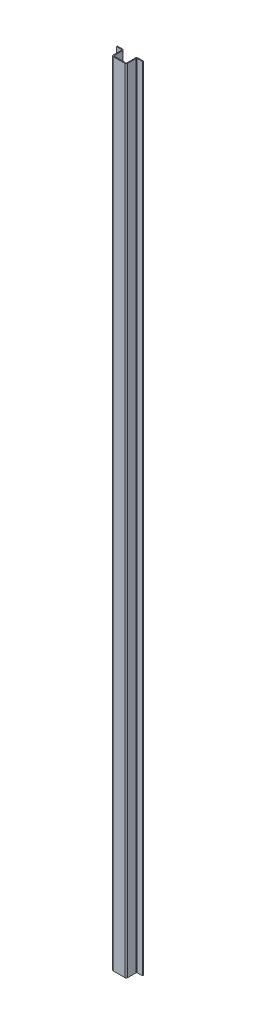
ISO-10303-21;
HEADER;
FILE_DESCRIPTION(('STEP AP214'),'2;1');
FILE_NAME('part.step','',(''),(''),'','','');
FILE_SCHEMA(('AUTOMOTIVE_DESIGN { 1 0 10303 214 1 1 1 1 }'));
ENDSEC;
DATA;
#1=APPLICATION_CONTEXT('core data for automotive mechanical design processes');
#2=APPLICATION_PROTOCOL_DEFINITION('international standard','automotive_design',2000,#1);
#3=PRODUCT_CONTEXT('',#1,'mechanical');
#4=PRODUCT('Part','Part','',(#3));
#5=PRODUCT_RELATED_PRODUCT_CATEGORY('part','',(#4));
#6=PRODUCT_DEFINITION_FORMATION('','',#4);
#7=PRODUCT_DEFINITION_CONTEXT('part definition',#1,'design');
#8=PRODUCT_DEFINITION('design','',#6,#7);
#9=PRODUCT_DEFINITION_SHAPE('','',#8);
#10=(LENGTH_UNIT() NAMED_UNIT(*) SI_UNIT(.MILLI.,.METRE.));
#11=(NAMED_UNIT(*) PLANE_ANGLE_UNIT() SI_UNIT($,.RADIAN.));
#12=(NAMED_UNIT(*) SI_UNIT($,.STERADIAN.) SOLID_ANGLE_UNIT());
#13=UNCERTAINTY_MEASURE_WITH_UNIT(LENGTH_MEASURE(1.E-05),#10,'distance_accuracy_value','');
#14=(GEOMETRIC_REPRESENTATION_CONTEXT(3) GLOBAL_UNCERTAINTY_ASSIGNED_CONTEXT((#13)) GLOBAL_UNIT_ASSIGNED_CONTEXT((#10,
#11,#12)) REPRESENTATION_CONTEXT('',''));
#15=CARTESIAN_POINT('',(0.,0.,0.));
#16=DIRECTION('',(0.,0.,1.));
#17=DIRECTION('',(1.,0.,0.));
#18=AXIS2_PLACEMENT_3D('',#15,#16,#17);
#19=CARTESIAN_POINT('',(-172.,-687.500000000001,2753.05890845996));
#20=DIRECTION('',(1.,0.,0.));
#21=DIRECTION('',(0.,0.,-1.));
#22=AXIS2_PLACEMENT_3D('',#19,#20,#21);
#23=PLANE('',#22);
#24=DIRECTION('',(0.,1.,0.));
#25=VECTOR('',#24,1.);
#26=CARTESIAN_POINT('',(-172.,-687.500000000001,1.5));
#27=LINE('',#26,#25);
#28=CARTESIAN_POINT('',(-172.,687.499999999999,1.5));
#29=VERTEX_POINT('',#28);
#30=CARTESIAN_POINT('',(-172.,-687.500000000001,1.5));
#31=VERTEX_POINT('',#30);
#32=EDGE_CURVE('E278',#29,#31,#27,.F.);
#33=ORIENTED_EDGE('',*,*,#32,.F.);
#34=DIRECTION('',(0.,0.,-1.));
#35=VECTOR('',#34,1.);
#36=CARTESIAN_POINT('',(-172.,687.499999999999,2753.05890845996));
#37=LINE('',#36,#35);
#38=CARTESIAN_POINT('',(-172.,687.499999999999,2.99999999999989));
#39=VERTEX_POINT('',#38);
#40=EDGE_CURVE('E273',#39,#29,#37,.T.);
#41=ORIENTED_EDGE('',*,*,#40,.F.);
#42=DIRECTION('',(0.,1.,0.));
#43=VECTOR('',#42,1.);
#44=CARTESIAN_POINT('',(-172.,-687.500000000001,3.));
#45=LINE('',#44,#43);
#46=CARTESIAN_POINT('',(-172.,-687.500000000001,2.99999999999989));
#47=VERTEX_POINT('',#46);
#48=EDGE_CURVE('E75',#39,#47,#45,.F.);
#49=ORIENTED_EDGE('',*,*,#48,.T.);
#50=DIRECTION('',(0.,0.,-1.));
#51=VECTOR('',#50,1.);
#52=CARTESIAN_POINT('',(-172.,-687.500000000001,2753.05890845996));
#53=LINE('',#52,#51);
#54=EDGE_CURVE('E286',#47,#31,#53,.T.);
#55=ORIENTED_EDGE('',*,*,#54,.T.);
#56=EDGE_LOOP('',(#33,#41,#49,#55));
#57=FACE_BOUND('',#56,.T.);
#58=ADVANCED_FACE('F36',(#57),#23,.T.);
#59=CARTESIAN_POINT('',(-183.5,-687.500000000001,2753.05890845996));
#60=DIRECTION('',(0.,1.,0.));
#61=DIRECTION('',(0.,0.,1.));
#62=AXIS2_PLACEMENT_3D('',#59,#60,#61);
#63=PLANE('',#62);
#64=DIRECTION('',(0.,0.,-1.));
#65=VECTOR('',#64,1.);
#66=CARTESIAN_POINT('',(-181.,-687.500000000001,2753.05890845996));
#67=LINE('',#66,#65);
#68=CARTESIAN_POINT('',(-181.,-687.500000000001,2.99999999999994));
#69=VERTEX_POINT('',#68);
#70=CARTESIAN_POINT('',(-181.,-687.500000000001,1.49999999999994));
#71=VERTEX_POINT('',#70);
#72=EDGE_CURVE('E283',#69,#71,#67,.T.);
#73=ORIENTED_EDGE('',*,*,#72,.T.);
#74=DIRECTION('',(1.,0.,0.));
#75=VECTOR('',#74,1.);
#76=CARTESIAN_POINT('',(-183.5,-687.500000000001,1.5));
#77=LINE('',#76,#75);
#78=EDGE_CURVE('E275',#31,#71,#77,.F.);
#79=ORIENTED_EDGE('',*,*,#78,.F.);
#80=ORIENTED_EDGE('',*,*,#54,.F.);
#81=DIRECTION('',(1.,0.,0.));
#82=VECTOR('',#81,1.);
#83=CARTESIAN_POINT('',(-183.5,-687.500000000001,3.));
#84=LINE('',#83,#82);
#85=EDGE_CURVE('E46',#69,#47,#84,.T.);
#86=ORIENTED_EDGE('',*,*,#85,.F.);
#87=EDGE_LOOP('',(#73,#79,#80,#86));
#88=FACE_BOUND('',#87,.T.);
#89=ADVANCED_FACE('F298',(#88),#63,.F.);
#90=CARTESIAN_POINT('',(-172.,-687.500000000001,1.5));
#91=DIRECTION('',(0.,0.,1.));
#92=DIRECTION('',(-1.,0.,0.));
#93=AXIS2_PLACEMENT_3D('',#90,#91,#92);
#94=PLANE('',#93);
#95=DIRECTION('',(0.,1.,0.));
#96=VECTOR('',#95,1.);
#97=CARTESIAN_POINT('',(-181.,-687.500000000001,1.5));
#98=LINE('',#97,#96);
#99=CARTESIAN_POINT('',(-181.,687.499999999999,1.5));
#100=VERTEX_POINT('',#99);
#101=EDGE_CURVE('E281',#71,#100,#98,.T.);
#102=ORIENTED_EDGE('',*,*,#101,.T.);
#103=DIRECTION('',(1.,0.,0.));
#104=VECTOR('',#103,1.);
#105=CARTESIAN_POINT('',(-205.5,687.499999999999,1.5));
#106=LINE('',#105,#104);
#107=EDGE_CURVE('E68',#100,#29,#106,.T.);
#108=ORIENTED_EDGE('',*,*,#107,.T.);
#109=ORIENTED_EDGE('',*,*,#32,.T.);
#110=ORIENTED_EDGE('',*,*,#78,.T.);
#111=EDGE_LOOP('',(#102,#108,#109,#110));
#112=FACE_BOUND('',#111,.T.);
#113=ADVANCED_FACE('F300',(#112),#94,.F.);
#114=CARTESIAN_POINT('',(-205.5,687.499999999999,2753.05890845996));
#115=DIRECTION('',(0.,-1.,0.));
#116=DIRECTION('',(0.,0.,-1.));
#117=AXIS2_PLACEMENT_3D('',#114,#115,#116);
#118=PLANE('',#117);
#119=ORIENTED_EDGE('',*,*,#40,.T.);
#120=ORIENTED_EDGE('',*,*,#107,.F.);
#121=DIRECTION('',(0.,0.,-1.));
#122=VECTOR('',#121,1.);
#123=CARTESIAN_POINT('',(-181.,687.499999999999,2753.05890845996));
#124=LINE('',#123,#122);
#125=CARTESIAN_POINT('',(-181.,687.499999999999,2.99999999999994));
#126=VERTEX_POINT('',#125);
#127=EDGE_CURVE('E220',#126,#100,#124,.T.);
#128=ORIENTED_EDGE('',*,*,#127,.F.);
#129=DIRECTION('',(1.,0.,0.));
#130=VECTOR('',#129,1.);
#131=CARTESIAN_POINT('',(-205.5,687.499999999999,3.));
#132=LINE('',#131,#130);
#133=EDGE_CURVE('E11',#39,#126,#132,.F.);
#134=ORIENTED_EDGE('',*,*,#133,.F.);
#135=EDGE_LOOP('',(#119,#120,#128,#134));
#136=FACE_BOUND('',#135,.T.);
#137=ADVANCED_FACE('F296',(#136),#118,.F.);
#138=CARTESIAN_POINT('',(-172.,-687.500000000001,3.));
#139=DIRECTION('',(0.,0.,1.));
#140=DIRECTION('',(-1.,0.,0.));
#141=AXIS2_PLACEMENT_3D('',#138,#139,#140);
#142=PLANE('',#141);
#143=DIRECTION('',(0.,1.,0.));
#144=VECTOR('',#143,1.);
#145=CARTESIAN_POINT('',(-181.,-687.500000000001,3.));
#146=LINE('',#145,#144);
#147=EDGE_CURVE('E40',#69,#126,#146,.T.);
#148=ORIENTED_EDGE('',*,*,#147,.F.);
#149=ORIENTED_EDGE('',*,*,#85,.T.);
#150=ORIENTED_EDGE('',*,*,#48,.F.);
#151=ORIENTED_EDGE('',*,*,#133,.T.);
#152=EDGE_LOOP('',(#148,#149,#150,#151));
#153=FACE_BOUND('',#152,.T.);
#154=ADVANCED_FACE('F38',(#153),#142,.T.);
#155=CARTESIAN_POINT('',(-217.,-687.500000000001,2753.05890845996));
#156=DIRECTION('',(-1.,0.,0.));
#157=DIRECTION('',(0.,0.,1.));
#158=AXIS2_PLACEMENT_3D('',#155,#156,#157);
#159=PLANE('',#158);
#160=DIRECTION('',(0.,1.,0.));
#161=VECTOR('',#160,1.);
#162=CARTESIAN_POINT('',(-217.,-687.500000000001,1.49999999999997));
#163=LINE('',#162,#161);
#164=CARTESIAN_POINT('',(-217.,-687.500000000001,1.49999999999997));
#165=VERTEX_POINT('',#164);
#166=CARTESIAN_POINT('',(-217.,687.499999999999,1.49999999999981));
#167=VERTEX_POINT('',#166);
#168=EDGE_CURVE('E99',#165,#167,#163,.T.);
#169=ORIENTED_EDGE('',*,*,#168,.F.);
#170=DIRECTION('',(0.,0.,-1.));
#171=VECTOR('',#170,1.);
#172=CARTESIAN_POINT('',(-217.,-687.500000000001,2753.05890845996));
#173=LINE('',#172,#171);
#174=CARTESIAN_POINT('',(-217.,-687.500000000001,2.99999999999986));
#175=VERTEX_POINT('',#174);
#176=EDGE_CURVE('E249',#175,#165,#173,.T.);
#177=ORIENTED_EDGE('',*,*,#176,.F.);
#178=DIRECTION('',(0.,1.,0.));
#179=VECTOR('',#178,1.);
#180=CARTESIAN_POINT('',(-217.,-687.500000000001,2.99999999999995));
#181=LINE('',#180,#179);
#182=CARTESIAN_POINT('',(-217.,687.499999999999,2.99999999999995));
#183=VERTEX_POINT('',#182);
#184=EDGE_CURVE('E263',#175,#183,#181,.T.);
#185=ORIENTED_EDGE('',*,*,#184,.T.);
#186=DIRECTION('',(0.,0.,-1.));
#187=VECTOR('',#186,1.);
#188=CARTESIAN_POINT('',(-217.,687.499999999999,2753.05890845996));
#189=LINE('',#188,#187);
#190=EDGE_CURVE('E106',#183,#167,#189,.T.);
#191=ORIENTED_EDGE('',*,*,#190,.T.);
#192=EDGE_LOOP('',(#169,#177,#185,#191));
#193=FACE_BOUND('',#192,.T.);
#194=ADVANCED_FACE('F326',(#193),#159,.T.);
#195=CARTESIAN_POINT('',(-205.5,687.499999999999,2753.05890845996));
#196=DIRECTION('',(0.,-1.,0.));
#197=DIRECTION('',(0.,0.,-1.));
#198=AXIS2_PLACEMENT_3D('',#195,#196,#197);
#199=PLANE('',#198);
#200=DIRECTION('',(0.,0.,-1.));
#201=VECTOR('',#200,1.);
#202=CARTESIAN_POINT('',(-208.,687.499999999999,2753.05890845996));
#203=LINE('',#202,#201);
#204=CARTESIAN_POINT('',(-208.,687.499999999999,2.99999999999997));
#205=VERTEX_POINT('',#204);
#206=CARTESIAN_POINT('',(-208.,687.499999999999,1.49999999999997));
#207=VERTEX_POINT('',#206);
#208=EDGE_CURVE('E259',#205,#207,#203,.T.);
#209=ORIENTED_EDGE('',*,*,#208,.T.);
#210=DIRECTION('',(1.,0.,0.));
#211=VECTOR('',#210,1.);
#212=CARTESIAN_POINT('',(-205.5,687.499999999999,1.49999999999995));
#213=LINE('',#212,#211);
#214=EDGE_CURVE('E256',#167,#207,#213,.T.);
#215=ORIENTED_EDGE('',*,*,#214,.F.);
#216=ORIENTED_EDGE('',*,*,#190,.F.);
#217=DIRECTION('',(1.,0.,0.));
#218=VECTOR('',#217,1.);
#219=CARTESIAN_POINT('',(-205.5,687.499999999999,2.99999999999995));
#220=LINE('',#219,#218);
#221=EDGE_CURVE('E245',#205,#183,#220,.F.);
#222=ORIENTED_EDGE('',*,*,#221,.F.);
#223=EDGE_LOOP('',(#209,#215,#216,#222));
#224=FACE_BOUND('',#223,.T.);
#225=ADVANCED_FACE('F323',(#224),#199,.F.);
#226=CARTESIAN_POINT('',(-207.,-687.500000000001,1.49999999999997));
#227=DIRECTION('',(0.,0.,1.));
#228=DIRECTION('',(-1.,0.,0.));
#229=AXIS2_PLACEMENT_3D('',#226,#227,#228);
#230=PLANE('',#229);
#231=ORIENTED_EDGE('',*,*,#168,.T.);
#232=ORIENTED_EDGE('',*,*,#214,.T.);
#233=DIRECTION('',(0.,1.,0.));
#234=VECTOR('',#233,1.);
#235=CARTESIAN_POINT('',(-208.,-687.500000000001,1.49999999999997));
#236=LINE('',#235,#234);
#237=CARTESIAN_POINT('',(-208.,-687.500000000001,1.49999999999995));
#238=VERTEX_POINT('',#237);
#239=EDGE_CURVE('E253',#207,#238,#236,.F.);
#240=ORIENTED_EDGE('',*,*,#239,.T.);
#241=DIRECTION('',(1.,0.,0.));
#242=VECTOR('',#241,1.);
#243=CARTESIAN_POINT('',(-183.5,-687.500000000001,1.49999999999997));
#244=LINE('',#243,#242);
#245=EDGE_CURVE('E251',#238,#165,#244,.F.);
#246=ORIENTED_EDGE('',*,*,#245,.T.);
#247=EDGE_LOOP('',(#231,#232,#240,#246));
#248=FACE_BOUND('',#247,.T.);
#249=ADVANCED_FACE('F320',(#248),#230,.F.);
#250=CARTESIAN_POINT('',(-183.5,-687.500000000001,2753.05890845996));
#251=DIRECTION('',(0.,1.,0.));
#252=DIRECTION('',(0.,0.,1.));
#253=AXIS2_PLACEMENT_3D('',#250,#251,#252);
#254=PLANE('',#253);
#255=ORIENTED_EDGE('',*,*,#176,.T.);
#256=ORIENTED_EDGE('',*,*,#245,.F.);
#257=DIRECTION('',(0.,0.,-1.));
#258=VECTOR('',#257,1.);
#259=CARTESIAN_POINT('',(-208.,-687.500000000001,2753.05890845996));
#260=LINE('',#259,#258);
#261=CARTESIAN_POINT('',(-208.,-687.500000000001,2.99999999999997));
#262=VERTEX_POINT('',#261);
#263=EDGE_CURVE('E265',#262,#238,#260,.T.);
#264=ORIENTED_EDGE('',*,*,#263,.F.);
#265=DIRECTION('',(1.,0.,0.));
#266=VECTOR('',#265,1.);
#267=CARTESIAN_POINT('',(-183.5,-687.500000000001,2.99999999999995));
#268=LINE('',#267,#266);
#269=EDGE_CURVE('E84',#175,#262,#268,.T.);
#270=ORIENTED_EDGE('',*,*,#269,.F.);
#271=EDGE_LOOP('',(#255,#256,#264,#270));
#272=FACE_BOUND('',#271,.T.);
#273=ADVANCED_FACE('F316',(#272),#254,.F.);
#274=CARTESIAN_POINT('',(-207.,-687.500000000001,2.99999999999995));
#275=DIRECTION('',(0.,0.,1.));
#276=DIRECTION('',(-1.,0.,0.));
#277=AXIS2_PLACEMENT_3D('',#274,#275,#276);
#278=PLANE('',#277);
#279=ORIENTED_EDGE('',*,*,#184,.F.);
#280=ORIENTED_EDGE('',*,*,#269,.T.);
#281=DIRECTION('',(0.,1.,0.));
#282=VECTOR('',#281,1.);
#283=CARTESIAN_POINT('',(-208.,-687.500000000001,2.99999999999995));
#284=LINE('',#283,#282);
#285=EDGE_CURVE('E268',#205,#262,#284,.F.);
#286=ORIENTED_EDGE('',*,*,#285,.F.);
#287=ORIENTED_EDGE('',*,*,#221,.T.);
#288=EDGE_LOOP('',(#279,#280,#286,#287));
#289=FACE_BOUND('',#288,.T.);
#290=ADVANCED_FACE('F313',(#289),#278,.T.);
#291=CARTESIAN_POINT('',(-2932.15290484002,687.499999999999,18.5));
#292=DIRECTION('',(0.,-1.,0.));
#293=DIRECTION('',(-1.,0.,0.));
#294=AXIS2_PLACEMENT_3D('',#291,#292,#293);
#295=PLANE('',#294);
#296=DIRECTION('',(0.,0.,-1.));
#297=VECTOR('',#296,1.);
#298=CARTESIAN_POINT('',(-182.,687.499999999999,18.5));
#299=LINE('',#298,#297);
#300=CARTESIAN_POINT('',(-182.,687.499999999999,3.99999999999998));
#301=VERTEX_POINT('',#300);
#302=CARTESIAN_POINT('',(-182.,687.499999999999,18.5));
#303=VERTEX_POINT('',#302);
#304=EDGE_CURVE('E232',#301,#303,#299,.F.);
#305=ORIENTED_EDGE('',*,*,#304,.F.);
#306=DIRECTION('',(1.,0.,0.));
#307=VECTOR('',#306,1.);
#308=CARTESIAN_POINT('',(-2932.15290484002,687.499999999999,3.99999999999998));
#309=LINE('',#308,#307);
#310=CARTESIAN_POINT('',(-183.5,687.499999999999,3.99999999999998));
#311=VERTEX_POINT('',#310);
#312=EDGE_CURVE('E218',#311,#301,#309,.T.);
#313=ORIENTED_EDGE('',*,*,#312,.F.);
#314=DIRECTION('',(0.,0.,-1.));
#315=VECTOR('',#314,1.);
#316=CARTESIAN_POINT('',(-183.5,687.499999999999,18.5));
#317=LINE('',#316,#315);
#318=CARTESIAN_POINT('',(-183.5,687.499999999999,18.5));
#319=VERTEX_POINT('',#318);
#320=EDGE_CURVE('E213',#319,#311,#317,.T.);
#321=ORIENTED_EDGE('',*,*,#320,.F.);
#322=DIRECTION('',(1.,0.,0.));
#323=VECTOR('',#322,1.);
#324=CARTESIAN_POINT('',(-2932.15290484002,687.499999999999,18.5));
#325=LINE('',#324,#323);
#326=EDGE_CURVE('E233',#319,#303,#325,.T.);
#327=ORIENTED_EDGE('',*,*,#326,.T.);
#328=EDGE_LOOP('',(#305,#313,#321,#327));
#329=FACE_BOUND('',#328,.T.);
#330=ADVANCED_FACE('F230',(#329),#295,.F.);
#331=CARTESIAN_POINT('',(-182.,-687.500000000001,2.99999999999998));
#332=DIRECTION('',(1.,0.,0.));
#333=DIRECTION('',(0.,0.,1.));
#334=AXIS2_PLACEMENT_3D('',#331,#332,#333);
#335=PLANE('',#334);
#336=DIRECTION('',(0.,1.,0.));
#337=VECTOR('',#336,1.);
#338=CARTESIAN_POINT('',(-182.,-687.500000000001,18.5));
#339=LINE('',#338,#337);
#340=CARTESIAN_POINT('',(-182.,-687.500000000001,18.5));
#341=VERTEX_POINT('',#340);
#342=EDGE_CURVE('E236',#303,#341,#339,.F.);
#343=ORIENTED_EDGE('',*,*,#342,.T.);
#344=DIRECTION('',(0.,0.,1.));
#345=VECTOR('',#344,1.);
#346=CARTESIAN_POINT('',(-182.,-687.500000000001,18.5));
#347=LINE('',#346,#345);
#348=CARTESIAN_POINT('',(-182.,-687.500000000001,3.99999999999998));
#349=VERTEX_POINT('',#348);
#350=EDGE_CURVE('E841',#341,#349,#347,.F.);
#351=ORIENTED_EDGE('',*,*,#350,.T.);
#352=DIRECTION('',(0.,1.,0.));
#353=VECTOR('',#352,1.);
#354=CARTESIAN_POINT('',(-182.,-687.500000000001,3.99999999999998));
#355=LINE('',#354,#353);
#356=EDGE_CURVE('E234',#301,#349,#355,.F.);
#357=ORIENTED_EDGE('',*,*,#356,.F.);
#358=ORIENTED_EDGE('',*,*,#304,.T.);
#359=EDGE_LOOP('',(#343,#351,#357,#358));
#360=FACE_BOUND('',#359,.T.);
#361=ADVANCED_FACE('F336',(#360),#335,.T.);
#362=CARTESIAN_POINT('',(-2932.15290484002,-687.500000000001,18.5));
#363=DIRECTION('',(0.,1.,0.));
#364=DIRECTION('',(1.,0.,0.));
#365=AXIS2_PLACEMENT_3D('',#362,#363,#364);
#366=PLANE('',#365);
#367=ORIENTED_EDGE('',*,*,#350,.F.);
#368=DIRECTION('',(1.,0.,0.));
#369=VECTOR('',#368,1.);
#370=CARTESIAN_POINT('',(-2932.15290484002,-687.500000000001,18.5));
#371=LINE('',#370,#369);
#372=CARTESIAN_POINT('',(-183.5,-687.5,18.5));
#373=VERTEX_POINT('',#372);
#374=EDGE_CURVE('E238',#373,#341,#371,.T.);
#375=ORIENTED_EDGE('',*,*,#374,.F.);
#376=DIRECTION('',(0.,0.,1.));
#377=VECTOR('',#376,1.);
#378=CARTESIAN_POINT('',(-183.5,-687.500000000001,18.5));
#379=LINE('',#378,#377);
#380=CARTESIAN_POINT('',(-183.5,-687.500000000001,3.99999999999998));
#381=VERTEX_POINT('',#380);
#382=EDGE_CURVE('E212',#381,#373,#379,.T.);
#383=ORIENTED_EDGE('',*,*,#382,.F.);
#384=DIRECTION('',(1.,0.,0.));
#385=VECTOR('',#384,1.);
#386=CARTESIAN_POINT('',(-2932.15290484002,-687.500000000001,3.99999999999998));
#387=LINE('',#386,#385);
#388=EDGE_CURVE('E837',#381,#349,#387,.T.);
#389=ORIENTED_EDGE('',*,*,#388,.T.);
#390=EDGE_LOOP('',(#367,#375,#383,#389));
#391=FACE_BOUND('',#390,.T.);
#392=ADVANCED_FACE('F333',(#391),#366,.F.);
#393=CARTESIAN_POINT('',(-183.5,-687.500000000001,2.99999999999998));
#394=DIRECTION('',(1.,0.,0.));
#395=DIRECTION('',(0.,0.,1.));
#396=AXIS2_PLACEMENT_3D('',#393,#394,#395);
#397=PLANE('',#396);
#398=DIRECTION('',(0.,1.,0.));
#399=VECTOR('',#398,1.);
#400=CARTESIAN_POINT('',(-183.5,-687.500000000001,18.5));
#401=LINE('',#400,#399);
#402=EDGE_CURVE('E225',#373,#319,#401,.T.);
#403=ORIENTED_EDGE('',*,*,#402,.T.);
#404=ORIENTED_EDGE('',*,*,#320,.T.);
#405=DIRECTION('',(0.,1.,0.));
#406=VECTOR('',#405,1.);
#407=CARTESIAN_POINT('',(-183.5,-687.500000000001,3.99999999999998));
#408=LINE('',#407,#406);
#409=EDGE_CURVE('E201',#311,#381,#408,.F.);
#410=ORIENTED_EDGE('',*,*,#409,.T.);
#411=ORIENTED_EDGE('',*,*,#382,.T.);
#412=EDGE_LOOP('',(#403,#404,#410,#411));
#413=FACE_BOUND('',#412,.T.);
#414=ADVANCED_FACE('F224',(#413),#397,.F.);
#415=CARTESIAN_POINT('',(2543.15290484002,-687.500000000001,18.5));
#416=DIRECTION('',(0.,1.,0.));
#417=DIRECTION('',(-1.,0.,0.));
#418=AXIS2_PLACEMENT_3D('',#415,#416,#417);
#419=PLANE('',#418);
#420=DIRECTION('',(0.,0.,1.));
#421=VECTOR('',#420,1.);
#422=CARTESIAN_POINT('',(-207.,-687.500000000001,18.5));
#423=LINE('',#422,#421);
#424=CARTESIAN_POINT('',(-207.,-687.500000000001,3.99999999999998));
#425=VERTEX_POINT('',#424);
#426=CARTESIAN_POINT('',(-207.,-687.500000000001,18.5));
#427=VERTEX_POINT('',#426);
#428=EDGE_CURVE('E824',#425,#427,#423,.T.);
#429=ORIENTED_EDGE('',*,*,#428,.F.);
#430=DIRECTION('',(-1.,0.,0.));
#431=VECTOR('',#430,1.);
#432=CARTESIAN_POINT('',(2543.15290484002,-687.500000000001,3.99999999999998));
#433=LINE('',#432,#431);
#434=CARTESIAN_POINT('',(-205.5,-687.500000000001,3.99999999999998));
#435=VERTEX_POINT('',#434);
#436=EDGE_CURVE('E830',#435,#425,#433,.T.);
#437=ORIENTED_EDGE('',*,*,#436,.F.);
#438=DIRECTION('',(0.,0.,1.));
#439=VECTOR('',#438,1.);
#440=CARTESIAN_POINT('',(-205.5,-687.500000000001,18.5));
#441=LINE('',#440,#439);
#442=CARTESIAN_POINT('',(-205.5,-687.500000000001,18.5));
#443=VERTEX_POINT('',#442);
#444=EDGE_CURVE('E244',#443,#435,#441,.F.);
#445=ORIENTED_EDGE('',*,*,#444,.F.);
#446=DIRECTION('',(-1.,0.,0.));
#447=VECTOR('',#446,1.);
#448=CARTESIAN_POINT('',(2543.15290484002,-687.500000000001,18.5));
#449=LINE('',#448,#447);
#450=EDGE_CURVE('E827',#443,#427,#449,.T.);
#451=ORIENTED_EDGE('',*,*,#450,.T.);
#452=EDGE_LOOP('',(#429,#437,#445,#451));
#453=FACE_BOUND('',#452,.T.);
#454=ADVANCED_FACE('F332',(#453),#419,.F.);
#455=CARTESIAN_POINT('',(-207.,-687.500000000001,21.));
#456=DIRECTION('',(-1.,0.,0.));
#457=DIRECTION('',(0.,0.,-1.));
#458=AXIS2_PLACEMENT_3D('',#455,#456,#457);
#459=PLANE('',#458);
#460=DIRECTION('',(0.,1.,0.));
#461=VECTOR('',#460,1.);
#462=CARTESIAN_POINT('',(-207.,-687.500000000001,3.99999999999998));
#463=LINE('',#462,#461);
#464=CARTESIAN_POINT('',(-207.,687.499999999999,3.99999999999998));
#465=VERTEX_POINT('',#464);
#466=EDGE_CURVE('E743',#425,#465,#463,.T.);
#467=ORIENTED_EDGE('',*,*,#466,.F.);
#468=ORIENTED_EDGE('',*,*,#428,.T.);
#469=DIRECTION('',(0.,1.,0.));
#470=VECTOR('',#469,1.);
#471=CARTESIAN_POINT('',(-207.,-687.500000000001,18.5));
#472=LINE('',#471,#470);
#473=CARTESIAN_POINT('',(-207.,687.499999999999,18.5));
#474=VERTEX_POINT('',#473);
#475=EDGE_CURVE('E821',#427,#474,#472,.T.);
#476=ORIENTED_EDGE('',*,*,#475,.T.);
#477=DIRECTION('',(0.,0.,-1.));
#478=VECTOR('',#477,1.);
#479=CARTESIAN_POINT('',(-207.,687.499999999999,18.5));
#480=LINE('',#479,#478);
#481=EDGE_CURVE('E818',#474,#465,#480,.T.);
#482=ORIENTED_EDGE('',*,*,#481,.T.);
#483=EDGE_LOOP('',(#467,#468,#476,#482));
#484=FACE_BOUND('',#483,.T.);
#485=ADVANCED_FACE('F351',(#484),#459,.T.);
#486=CARTESIAN_POINT('',(2543.15290484002,687.499999999999,18.5));
#487=DIRECTION('',(0.,-1.,0.));
#488=DIRECTION('',(1.,0.,0.));
#489=AXIS2_PLACEMENT_3D('',#486,#487,#488);
#490=PLANE('',#489);
#491=ORIENTED_EDGE('',*,*,#481,.F.);
#492=DIRECTION('',(-1.,0.,0.));
#493=VECTOR('',#492,1.);
#494=CARTESIAN_POINT('',(2543.15290484002,687.499999999999,18.5));
#495=LINE('',#494,#493);
#496=CARTESIAN_POINT('',(-205.5,687.499999999999,18.5));
#497=VERTEX_POINT('',#496);
#498=EDGE_CURVE('E805',#497,#474,#495,.T.);
#499=ORIENTED_EDGE('',*,*,#498,.F.);
#500=DIRECTION('',(0.,0.,-1.));
#501=VECTOR('',#500,1.);
#502=CARTESIAN_POINT('',(-205.5,687.499999999999,18.5));
#503=LINE('',#502,#501);
#504=CARTESIAN_POINT('',(-205.5,687.499999999999,3.99999999999998));
#505=VERTEX_POINT('',#504);
#506=EDGE_CURVE('E811',#505,#497,#503,.F.);
#507=ORIENTED_EDGE('',*,*,#506,.F.);
#508=DIRECTION('',(-1.,0.,0.));
#509=VECTOR('',#508,1.);
#510=CARTESIAN_POINT('',(2543.15290484002,687.499999999999,3.99999999999998));
#511=LINE('',#510,#509);
#512=EDGE_CURVE('E816',#505,#465,#511,.T.);
#513=ORIENTED_EDGE('',*,*,#512,.T.);
#514=EDGE_LOOP('',(#491,#499,#507,#513));
#515=FACE_BOUND('',#514,.T.);
#516=ADVANCED_FACE('F347',(#515),#490,.F.);
#517=CARTESIAN_POINT('',(-205.5,-687.500000000001,21.));
#518=DIRECTION('',(-1.,0.,0.));
#519=DIRECTION('',(0.,0.,-1.));
#520=AXIS2_PLACEMENT_3D('',#517,#518,#519);
#521=PLANE('',#520);
#522=DIRECTION('',(0.,1.,0.));
#523=VECTOR('',#522,1.);
#524=CARTESIAN_POINT('',(-205.5,-687.500000000001,3.99999999999998));
#525=LINE('',#524,#523);
#526=EDGE_CURVE('E814',#435,#505,#525,.T.);
#527=ORIENTED_EDGE('',*,*,#526,.T.);
#528=ORIENTED_EDGE('',*,*,#506,.T.);
#529=DIRECTION('',(0.,1.,0.));
#530=VECTOR('',#529,1.);
#531=CARTESIAN_POINT('',(-205.5,-687.500000000001,18.5));
#532=LINE('',#531,#530);
#533=EDGE_CURVE('E808',#497,#443,#532,.F.);
#534=ORIENTED_EDGE('',*,*,#533,.T.);
#535=ORIENTED_EDGE('',*,*,#444,.T.);
#536=EDGE_LOOP('',(#527,#528,#534,#535));
#537=FACE_BOUND('',#536,.T.);
#538=ADVANCED_FACE('F343',(#537),#521,.F.);
#539=CARTESIAN_POINT('',(-205.5,687.499999999999,-2729.29089370561));
#540=DIRECTION('',(0.,-1.,0.));
#541=DIRECTION('',(0.,0.,-1.));
#542=AXIS2_PLACEMENT_3D('',#539,#540,#541);
#543=PLANE('',#542);
#544=DIRECTION('',(-1.,0.,0.));
#545=VECTOR('',#544,1.);
#546=CARTESIAN_POINT('',(-182.,687.499999999999,21.));
#547=LINE('',#546,#545);
#548=CARTESIAN_POINT('',(-204.5,687.499999999999,21.));
#549=VERTEX_POINT('',#548);
#550=CARTESIAN_POINT('',(-184.5,687.499999999999,21.));
#551=VERTEX_POINT('',#550);
#552=EDGE_CURVE('E780',#549,#551,#547,.F.);
#553=ORIENTED_EDGE('',*,*,#552,.T.);
#554=DIRECTION('',(0.,0.,1.));
#555=VECTOR('',#554,1.);
#556=CARTESIAN_POINT('',(-184.5,687.499999999999,-2729.29089370561));
#557=LINE('',#556,#555);
#558=CARTESIAN_POINT('',(-184.5,687.499999999999,19.5));
#559=VERTEX_POINT('',#558);
#560=EDGE_CURVE('E800',#559,#551,#557,.T.);
#561=ORIENTED_EDGE('',*,*,#560,.F.);
#562=DIRECTION('',(1.,0.,0.));
#563=VECTOR('',#562,1.);
#564=CARTESIAN_POINT('',(-205.5,687.499999999999,19.5));
#565=LINE('',#564,#563);
#566=CARTESIAN_POINT('',(-204.5,687.499999999999,19.5));
#567=VERTEX_POINT('',#566);
#568=EDGE_CURVE('E786',#567,#559,#565,.T.);
#569=ORIENTED_EDGE('',*,*,#568,.F.);
#570=DIRECTION('',(0.,0.,1.));
#571=VECTOR('',#570,1.);
#572=CARTESIAN_POINT('',(-204.5,687.499999999999,-2729.29089370561));
#573=LINE('',#572,#571);
#574=EDGE_CURVE('E802',#567,#549,#573,.T.);
#575=ORIENTED_EDGE('',*,*,#574,.T.);
#576=EDGE_LOOP('',(#553,#561,#569,#575));
#577=FACE_BOUND('',#576,.T.);
#578=ADVANCED_FACE('F346',(#577),#543,.F.);
#579=CARTESIAN_POINT('',(-183.5,-687.500000000001,-2729.29089370561));
#580=DIRECTION('',(0.,1.,0.));
#581=DIRECTION('',(0.,0.,1.));
#582=AXIS2_PLACEMENT_3D('',#579,#580,#581);
#583=PLANE('',#582);
#584=DIRECTION('',(-1.,0.,0.));
#585=VECTOR('',#584,1.);
#586=CARTESIAN_POINT('',(-182.,-687.500000000001,21.));
#587=LINE('',#586,#585);
#588=CARTESIAN_POINT('',(-184.5,-687.5,21.));
#589=VERTEX_POINT('',#588);
#590=CARTESIAN_POINT('',(-204.5,-687.500000000001,21.));
#591=VERTEX_POINT('',#590);
#592=EDGE_CURVE('E774',#589,#591,#587,.T.);
#593=ORIENTED_EDGE('',*,*,#592,.T.);
#594=DIRECTION('',(0.,0.,1.));
#595=VECTOR('',#594,1.);
#596=CARTESIAN_POINT('',(-204.5,-687.500000000001,-2729.29089370561));
#597=LINE('',#596,#595);
#598=CARTESIAN_POINT('',(-204.5,-687.500000000001,19.5));
#599=VERTEX_POINT('',#598);
#600=EDGE_CURVE('E795',#599,#591,#597,.T.);
#601=ORIENTED_EDGE('',*,*,#600,.F.);
#602=DIRECTION('',(1.,0.,0.));
#603=VECTOR('',#602,1.);
#604=CARTESIAN_POINT('',(-183.5,-687.500000000001,19.5));
#605=LINE('',#604,#603);
#606=CARTESIAN_POINT('',(-184.5,-687.500000000001,19.4999999999999));
#607=VERTEX_POINT('',#606);
#608=EDGE_CURVE('E792',#607,#599,#605,.F.);
#609=ORIENTED_EDGE('',*,*,#608,.F.);
#610=DIRECTION('',(0.,0.,1.));
#611=VECTOR('',#610,1.);
#612=CARTESIAN_POINT('',(-184.5,-687.500000000001,-2729.29089370561));
#613=LINE('',#612,#611);
#614=EDGE_CURVE('E797',#607,#589,#613,.T.);
#615=ORIENTED_EDGE('',*,*,#614,.T.);
#616=EDGE_LOOP('',(#593,#601,#609,#615));
#617=FACE_BOUND('',#616,.T.);
#618=ADVANCED_FACE('F361',(#617),#583,.F.);
#619=CARTESIAN_POINT('',(-182.,-687.500000000001,19.5));
#620=DIRECTION('',(0.,0.,1.));
#621=DIRECTION('',(-1.,0.,0.));
#622=AXIS2_PLACEMENT_3D('',#619,#620,#621);
#623=PLANE('',#622);
#624=DIRECTION('',(0.,1.,0.));
#625=VECTOR('',#624,1.);
#626=CARTESIAN_POINT('',(-204.5,-687.500000000001,19.5));
#627=LINE('',#626,#625);
#628=EDGE_CURVE('E783',#599,#567,#627,.T.);
#629=ORIENTED_EDGE('',*,*,#628,.T.);
#630=ORIENTED_EDGE('',*,*,#568,.T.);
#631=DIRECTION('',(0.,1.,0.));
#632=VECTOR('',#631,1.);
#633=CARTESIAN_POINT('',(-184.5,-687.500000000001,19.5));
#634=LINE('',#633,#632);
#635=EDGE_CURVE('E789',#559,#607,#634,.F.);
#636=ORIENTED_EDGE('',*,*,#635,.T.);
#637=ORIENTED_EDGE('',*,*,#608,.T.);
#638=EDGE_LOOP('',(#629,#630,#636,#637));
#639=FACE_BOUND('',#638,.T.);
#640=ADVANCED_FACE('F365',(#639),#623,.F.);
#641=CARTESIAN_POINT('',(-182.,-687.500000000001,21.));
#642=DIRECTION('',(0.,0.,1.));
#643=DIRECTION('',(-1.,0.,0.));
#644=AXIS2_PLACEMENT_3D('',#641,#642,#643);
#645=PLANE('',#644);
#646=DIRECTION('',(0.,1.,0.));
#647=VECTOR('',#646,1.);
#648=CARTESIAN_POINT('',(-204.5,-687.500000000001,21.));
#649=LINE('',#648,#647);
#650=EDGE_CURVE('E768',#591,#549,#649,.T.);
#651=ORIENTED_EDGE('',*,*,#650,.F.);
#652=ORIENTED_EDGE('',*,*,#592,.F.);
#653=DIRECTION('',(0.,1.,0.));
#654=VECTOR('',#653,1.);
#655=CARTESIAN_POINT('',(-184.5,-687.500000000001,21.));
#656=LINE('',#655,#654);
#657=EDGE_CURVE('E777',#551,#589,#656,.F.);
#658=ORIENTED_EDGE('',*,*,#657,.F.);
#659=ORIENTED_EDGE('',*,*,#552,.F.);
#660=EDGE_LOOP('',(#651,#652,#658,#659));
#661=FACE_BOUND('',#660,.T.);
#662=ADVANCED_FACE('F369',(#661),#645,.T.);
#663=CARTESIAN_POINT('',(-204.5,687.499999999999,18.5));
#664=DIRECTION('',(0.,1.,0.));
#665=DIRECTION('',(0.,0.,1.));
#666=AXIS2_PLACEMENT_3D('',#663,#664,#665);
#667=PLANE('',#666);
#668=ORIENTED_EDGE('',*,*,#574,.F.);
#669=CARTESIAN_POINT('',(-204.5,687.499999999999,18.5));
#670=DIRECTION('',(0.,1.,0.));
#671=DIRECTION('',(0.,0.,1.));
#672=AXIS2_PLACEMENT_3D('',#669,#670,#671);
#673=CIRCLE('',#672,1.00000000000001);
#674=EDGE_CURVE('E766',#567,#497,#673,.F.);
#675=ORIENTED_EDGE('',*,*,#674,.T.);
#676=ORIENTED_EDGE('',*,*,#498,.T.);
#677=CARTESIAN_POINT('',(-204.5,687.499999999999,18.5));
#678=DIRECTION('',(0.,1.,0.));
#679=DIRECTION('',(0.,0.,1.));
#680=AXIS2_PLACEMENT_3D('',#677,#678,#679);
#681=CIRCLE('',#680,2.50000000000002);
#682=EDGE_CURVE('E765',#549,#474,#681,.F.);
#683=ORIENTED_EDGE('',*,*,#682,.F.);
#684=EDGE_LOOP('',(#668,#675,#676,#683));
#685=FACE_BOUND('',#684,.T.);
#686=ADVANCED_FACE('F373',(#685),#667,.T.);
#687=CARTESIAN_POINT('',(-204.5,-687.500000000001,18.5));
#688=DIRECTION('',(0.,-1.,0.));
#689=DIRECTION('',(0.,0.,-1.));
#690=AXIS2_PLACEMENT_3D('',#687,#688,#689);
#691=PLANE('',#690);
#692=ORIENTED_EDGE('',*,*,#450,.F.);
#693=CARTESIAN_POINT('',(-204.5,-687.500000000001,18.5));
#694=DIRECTION('',(0.,1.,0.));
#695=DIRECTION('',(0.,0.,1.));
#696=AXIS2_PLACEMENT_3D('',#693,#694,#695);
#697=CIRCLE('',#696,1.00000000000001);
#698=EDGE_CURVE('E757',#443,#599,#697,.T.);
#699=ORIENTED_EDGE('',*,*,#698,.T.);
#700=ORIENTED_EDGE('',*,*,#600,.T.);
#701=CARTESIAN_POINT('',(-204.5,-687.500000000001,18.5));
#702=DIRECTION('',(0.,1.,0.));
#703=DIRECTION('',(0.,0.,1.));
#704=AXIS2_PLACEMENT_3D('',#701,#702,#703);
#705=CIRCLE('',#704,2.50000000000002);
#706=EDGE_CURVE('E762',#427,#591,#705,.T.);
#707=ORIENTED_EDGE('',*,*,#706,.F.);
#708=EDGE_LOOP('',(#692,#699,#700,#707));
#709=FACE_BOUND('',#708,.T.);
#710=ADVANCED_FACE('F377',(#709),#691,.T.);
#711=CARTESIAN_POINT('',(-204.5,-2064.65512924289,18.5));
#712=DIRECTION('',(0.,1.,0.));
#713=DIRECTION('',(0.,0.,1.));
#714=AXIS2_PLACEMENT_3D('',#711,#712,#713);
#715=CYLINDRICAL_SURFACE('',#714,2.50000000000002);
#716=ORIENTED_EDGE('',*,*,#706,.T.);
#717=ORIENTED_EDGE('',*,*,#650,.T.);
#718=ORIENTED_EDGE('',*,*,#682,.T.);
#719=ORIENTED_EDGE('',*,*,#475,.F.);
#720=EDGE_LOOP('',(#716,#717,#718,#719));
#721=FACE_BOUND('',#720,.T.);
#722=ADVANCED_FACE('F381',(#721),#715,.T.);
#723=CARTESIAN_POINT('',(-204.5,-2064.65512924289,18.5));
#724=DIRECTION('',(0.,1.,0.));
#725=DIRECTION('',(0.,0.,1.));
#726=AXIS2_PLACEMENT_3D('',#723,#724,#725);
#727=CYLINDRICAL_SURFACE('',#726,1.00000000000001);
#728=ORIENTED_EDGE('',*,*,#698,.F.);
#729=ORIENTED_EDGE('',*,*,#533,.F.);
#730=ORIENTED_EDGE('',*,*,#674,.F.);
#731=ORIENTED_EDGE('',*,*,#628,.F.);
#732=EDGE_LOOP('',(#728,#729,#730,#731));
#733=FACE_BOUND('',#732,.T.);
#734=ADVANCED_FACE('F383',(#733),#727,.F.);
#735=CARTESIAN_POINT('',(-184.5,-687.5,18.5));
#736=DIRECTION('',(0.,-1.,0.));
#737=DIRECTION('',(0.,0.,-1.));
#738=AXIS2_PLACEMENT_3D('',#735,#736,#737);
#739=PLANE('',#738);
#740=ORIENTED_EDGE('',*,*,#614,.F.);
#741=CARTESIAN_POINT('',(-184.5,-687.5,18.5));
#742=DIRECTION('',(0.,-1.,0.));
#743=DIRECTION('',(0.,0.,-1.));
#744=AXIS2_PLACEMENT_3D('',#741,#742,#743);
#745=CIRCLE('',#744,0.999999999999999);
#746=EDGE_CURVE('E755',#607,#373,#745,.F.);
#747=ORIENTED_EDGE('',*,*,#746,.T.);
#748=ORIENTED_EDGE('',*,*,#374,.T.);
#749=CARTESIAN_POINT('',(-184.5,-687.5,18.5));
#750=DIRECTION('',(0.,-1.,0.));
#751=DIRECTION('',(0.,0.,-1.));
#752=AXIS2_PLACEMENT_3D('',#749,#750,#751);
#753=CIRCLE('',#752,2.5);
#754=EDGE_CURVE('E754',#589,#341,#753,.F.);
#755=ORIENTED_EDGE('',*,*,#754,.F.);
#756=EDGE_LOOP('',(#740,#747,#748,#755));
#757=FACE_BOUND('',#756,.T.);
#758=ADVANCED_FACE('F386',(#757),#739,.T.);
#759=CARTESIAN_POINT('',(-184.5,687.499999999999,18.5));
#760=DIRECTION('',(0.,1.,0.));
#761=DIRECTION('',(0.,0.,1.));
#762=AXIS2_PLACEMENT_3D('',#759,#760,#761);
#763=PLANE('',#762);
#764=ORIENTED_EDGE('',*,*,#326,.F.);
#765=CARTESIAN_POINT('',(-184.5,687.499999999999,18.5));
#766=DIRECTION('',(0.,-1.,0.));
#767=DIRECTION('',(0.,0.,-1.));
#768=AXIS2_PLACEMENT_3D('',#765,#766,#767);
#769=CIRCLE('',#768,0.999999999999999);
#770=EDGE_CURVE('E758',#319,#559,#769,.T.);
#771=ORIENTED_EDGE('',*,*,#770,.T.);
#772=ORIENTED_EDGE('',*,*,#560,.T.);
#773=CARTESIAN_POINT('',(-184.5,687.499999999999,18.5));
#774=DIRECTION('',(0.,-1.,0.));
#775=DIRECTION('',(0.,0.,-1.));
#776=AXIS2_PLACEMENT_3D('',#773,#774,#775);
#777=CIRCLE('',#776,2.5);
#778=EDGE_CURVE('E751',#303,#551,#777,.T.);
#779=ORIENTED_EDGE('',*,*,#778,.F.);
#780=EDGE_LOOP('',(#764,#771,#772,#779));
#781=FACE_BOUND('',#780,.T.);
#782=ADVANCED_FACE('F393',(#781),#763,.T.);
#783=CARTESIAN_POINT('',(-184.5,2063.74062212972,18.5));
#784=DIRECTION('',(0.,-1.,0.));
#785=DIRECTION('',(0.,0.,-1.));
#786=AXIS2_PLACEMENT_3D('',#783,#784,#785);
#787=CYLINDRICAL_SURFACE('',#786,2.5);
#788=ORIENTED_EDGE('',*,*,#778,.T.);
#789=ORIENTED_EDGE('',*,*,#657,.T.);
#790=ORIENTED_EDGE('',*,*,#754,.T.);
#791=ORIENTED_EDGE('',*,*,#342,.F.);
#792=EDGE_LOOP('',(#788,#789,#790,#791));
#793=FACE_BOUND('',#792,.T.);
#794=ADVANCED_FACE('F397',(#793),#787,.T.);
#795=CARTESIAN_POINT('',(-184.5,2063.74062212972,18.5));
#796=DIRECTION('',(0.,-1.,0.));
#797=DIRECTION('',(0.,0.,-1.));
#798=AXIS2_PLACEMENT_3D('',#795,#796,#797);
#799=CYLINDRICAL_SURFACE('',#798,0.999999999999999);
#800=ORIENTED_EDGE('',*,*,#770,.F.);
#801=ORIENTED_EDGE('',*,*,#402,.F.);
#802=ORIENTED_EDGE('',*,*,#746,.F.);
#803=ORIENTED_EDGE('',*,*,#635,.F.);
#804=EDGE_LOOP('',(#800,#801,#802,#803));
#805=FACE_BOUND('',#804,.T.);
#806=ADVANCED_FACE('F399',(#805),#799,.F.);
#807=CARTESIAN_POINT('',(-208.,-687.500000000001,3.99999999999998));
#808=DIRECTION('',(0.,1.,0.));
#809=DIRECTION('',(0.,0.,1.));
#810=AXIS2_PLACEMENT_3D('',#807,#808,#809);
#811=PLANE('',#810);
#812=ORIENTED_EDGE('',*,*,#436,.T.);
#813=CARTESIAN_POINT('',(-208.,-687.500000000001,3.99999999999998));
#814=DIRECTION('',(0.,-1.,0.));
#815=DIRECTION('',(0.,0.,-1.));
#816=AXIS2_PLACEMENT_3D('',#813,#814,#815);
#817=CIRCLE('',#816,1.);
#818=EDGE_CURVE('E745',#262,#425,#817,.T.);
#819=ORIENTED_EDGE('',*,*,#818,.F.);
#820=ORIENTED_EDGE('',*,*,#263,.T.);
#821=CARTESIAN_POINT('',(-208.,-687.500000000001,3.99999999999998));
#822=DIRECTION('',(0.,-1.,0.));
#823=DIRECTION('',(0.,0.,-1.));
#824=AXIS2_PLACEMENT_3D('',#821,#822,#823);
#825=CIRCLE('',#824,2.5);
#826=EDGE_CURVE('E736',#238,#435,#825,.T.);
#827=ORIENTED_EDGE('',*,*,#826,.T.);
#828=EDGE_LOOP('',(#812,#819,#820,#827));
#829=FACE_BOUND('',#828,.T.);
#830=ADVANCED_FACE('F402',(#829),#811,.F.);
#831=CARTESIAN_POINT('',(-208.,687.499999999999,3.99999999999998));
#832=DIRECTION('',(0.,-1.,0.));
#833=DIRECTION('',(0.,0.,-1.));
#834=AXIS2_PLACEMENT_3D('',#831,#832,#833);
#835=PLANE('',#834);
#836=CARTESIAN_POINT('',(-208.,687.499999999999,3.99999999999998));
#837=DIRECTION('',(0.,-1.,0.));
#838=DIRECTION('',(0.,0.,-1.));
#839=AXIS2_PLACEMENT_3D('',#836,#837,#838);
#840=CIRCLE('',#839,1.);
#841=EDGE_CURVE('E739',#465,#205,#840,.F.);
#842=ORIENTED_EDGE('',*,*,#841,.F.);
#843=ORIENTED_EDGE('',*,*,#512,.F.);
#844=CARTESIAN_POINT('',(-208.,687.499999999999,3.99999999999998));
#845=DIRECTION('',(0.,-1.,0.));
#846=DIRECTION('',(0.,0.,-1.));
#847=AXIS2_PLACEMENT_3D('',#844,#845,#846);
#848=CIRCLE('',#847,2.5);
#849=EDGE_CURVE('E733',#505,#207,#848,.F.);
#850=ORIENTED_EDGE('',*,*,#849,.T.);
#851=ORIENTED_EDGE('',*,*,#208,.F.);
#852=EDGE_LOOP('',(#842,#843,#850,#851));
#853=FACE_BOUND('',#852,.T.);
#854=ADVANCED_FACE('F407',(#853),#835,.F.);
#855=CARTESIAN_POINT('',(-208.,2063.02253707455,3.99999999999998));
#856=DIRECTION('',(0.,-1.,0.));
#857=DIRECTION('',(0.,0.,-1.));
#858=AXIS2_PLACEMENT_3D('',#855,#856,#857);
#859=CYLINDRICAL_SURFACE('',#858,2.5);
#860=ORIENTED_EDGE('',*,*,#239,.F.);
#861=ORIENTED_EDGE('',*,*,#849,.F.);
#862=ORIENTED_EDGE('',*,*,#526,.F.);
#863=ORIENTED_EDGE('',*,*,#826,.F.);
#864=EDGE_LOOP('',(#860,#861,#862,#863));
#865=FACE_BOUND('',#864,.T.);
#866=ADVANCED_FACE('F410',(#865),#859,.T.);
#867=CARTESIAN_POINT('',(-208.,2063.02253707455,3.99999999999998));
#868=DIRECTION('',(0.,-1.,0.));
#869=DIRECTION('',(0.,0.,-1.));
#870=AXIS2_PLACEMENT_3D('',#867,#868,#869);
#871=CYLINDRICAL_SURFACE('',#870,1.);
#872=ORIENTED_EDGE('',*,*,#285,.T.);
#873=ORIENTED_EDGE('',*,*,#818,.T.);
#874=ORIENTED_EDGE('',*,*,#466,.T.);
#875=ORIENTED_EDGE('',*,*,#841,.T.);
#876=EDGE_LOOP('',(#872,#873,#874,#875));
#877=FACE_BOUND('',#876,.T.);
#878=ADVANCED_FACE('F415',(#877),#871,.F.);
#879=CARTESIAN_POINT('',(-181.,687.499999999999,3.99999999999998));
#880=DIRECTION('',(0.,-1.,0.));
#881=DIRECTION('',(0.,0.,-1.));
#882=AXIS2_PLACEMENT_3D('',#879,#880,#881);
#883=PLANE('',#882);
#884=ORIENTED_EDGE('',*,*,#312,.T.);
#885=CARTESIAN_POINT('',(-181.,687.499999999999,3.99999999999998));
#886=DIRECTION('',(0.,1.,0.));
#887=DIRECTION('',(0.,0.,1.));
#888=AXIS2_PLACEMENT_3D('',#885,#886,#887);
#889=CIRCLE('',#888,1.00000000000004);
#890=EDGE_CURVE('E292',#126,#301,#889,.T.);
#891=ORIENTED_EDGE('',*,*,#890,.F.);
#892=ORIENTED_EDGE('',*,*,#127,.T.);
#893=CARTESIAN_POINT('',(-181.,687.499999999999,3.99999999999998));
#894=DIRECTION('',(0.,1.,0.));
#895=DIRECTION('',(0.,0.,1.));
#896=AXIS2_PLACEMENT_3D('',#893,#894,#895);
#897=CIRCLE('',#896,2.50000000000004);
#898=EDGE_CURVE('E205',#100,#311,#897,.T.);
#899=ORIENTED_EDGE('',*,*,#898,.T.);
#900=EDGE_LOOP('',(#884,#891,#892,#899));
#901=FACE_BOUND('',#900,.T.);
#902=ADVANCED_FACE('F216',(#901),#883,.F.);
#903=CARTESIAN_POINT('',(-181.,-687.500000000001,3.99999999999998));
#904=DIRECTION('',(0.,1.,0.));
#905=DIRECTION('',(0.,0.,1.));
#906=AXIS2_PLACEMENT_3D('',#903,#904,#905);
#907=PLANE('',#906);
#908=CARTESIAN_POINT('',(-181.,-687.500000000001,3.99999999999998));
#909=DIRECTION('',(0.,1.,0.));
#910=DIRECTION('',(0.,0.,1.));
#911=AXIS2_PLACEMENT_3D('',#908,#909,#910);
#912=CIRCLE('',#911,1.00000000000004);
#913=EDGE_CURVE('E113',#349,#69,#912,.F.);
#914=ORIENTED_EDGE('',*,*,#913,.F.);
#915=ORIENTED_EDGE('',*,*,#388,.F.);
#916=CARTESIAN_POINT('',(-181.,-687.500000000001,3.99999999999998));
#917=DIRECTION('',(0.,1.,0.));
#918=DIRECTION('',(0.,0.,1.));
#919=AXIS2_PLACEMENT_3D('',#916,#917,#918);
#920=CIRCLE('',#919,2.50000000000004);
#921=EDGE_CURVE('E207',#381,#71,#920,.F.);
#922=ORIENTED_EDGE('',*,*,#921,.T.);
#923=ORIENTED_EDGE('',*,*,#72,.F.);
#924=EDGE_LOOP('',(#914,#915,#922,#923));
#925=FACE_BOUND('',#924,.T.);
#926=ADVANCED_FACE('F422',(#925),#907,.F.);
#927=CARTESIAN_POINT('',(-181.,-2063.24061872142,3.99999999999998));
#928=DIRECTION('',(0.,1.,0.));
#929=DIRECTION('',(0.,0.,1.));
#930=AXIS2_PLACEMENT_3D('',#927,#928,#929);
#931=CYLINDRICAL_SURFACE('',#930,2.50000000000004);
#932=ORIENTED_EDGE('',*,*,#101,.F.);
#933=ORIENTED_EDGE('',*,*,#921,.F.);
#934=ORIENTED_EDGE('',*,*,#409,.F.);
#935=ORIENTED_EDGE('',*,*,#898,.F.);
#936=EDGE_LOOP('',(#932,#933,#934,#935));
#937=FACE_BOUND('',#936,.T.);
#938=ADVANCED_FACE('F204',(#937),#931,.T.);
#939=CARTESIAN_POINT('',(-181.,-2063.24061872142,3.99999999999998));
#940=DIRECTION('',(0.,1.,0.));
#941=DIRECTION('',(0.,0.,1.));
#942=AXIS2_PLACEMENT_3D('',#939,#940,#941);
#943=CYLINDRICAL_SURFACE('',#942,1.00000000000004);
#944=ORIENTED_EDGE('',*,*,#147,.T.);
#945=ORIENTED_EDGE('',*,*,#890,.T.);
#946=ORIENTED_EDGE('',*,*,#356,.T.);
#947=ORIENTED_EDGE('',*,*,#913,.T.);
#948=EDGE_LOOP('',(#944,#945,#946,#947));
#949=FACE_BOUND('',#948,.T.);
#950=ADVANCED_FACE('F291',(#949),#943,.F.);
#951=CLOSED_SHELL('',(#58,#89,#113,#137,#154,#194,#225,#249,#273,#290,#330,#361,#392,#414,#454,
#485,#516,#538,#578,#618,#640,#662,#686,#710,#722,#734,#758,#782,#794,#806,#830,#854,#866,#878,
#902,#926,#938,#950));
#952=MANIFOLD_SOLID_BREP('B2',#951);
#953=ADVANCED_BREP_SHAPE_REPRESENTATION('',(#18,#952),#14);
#954=SHAPE_DEFINITION_REPRESENTATION(#9,#953);
ENDSEC;
END-ISO-10303-21;
